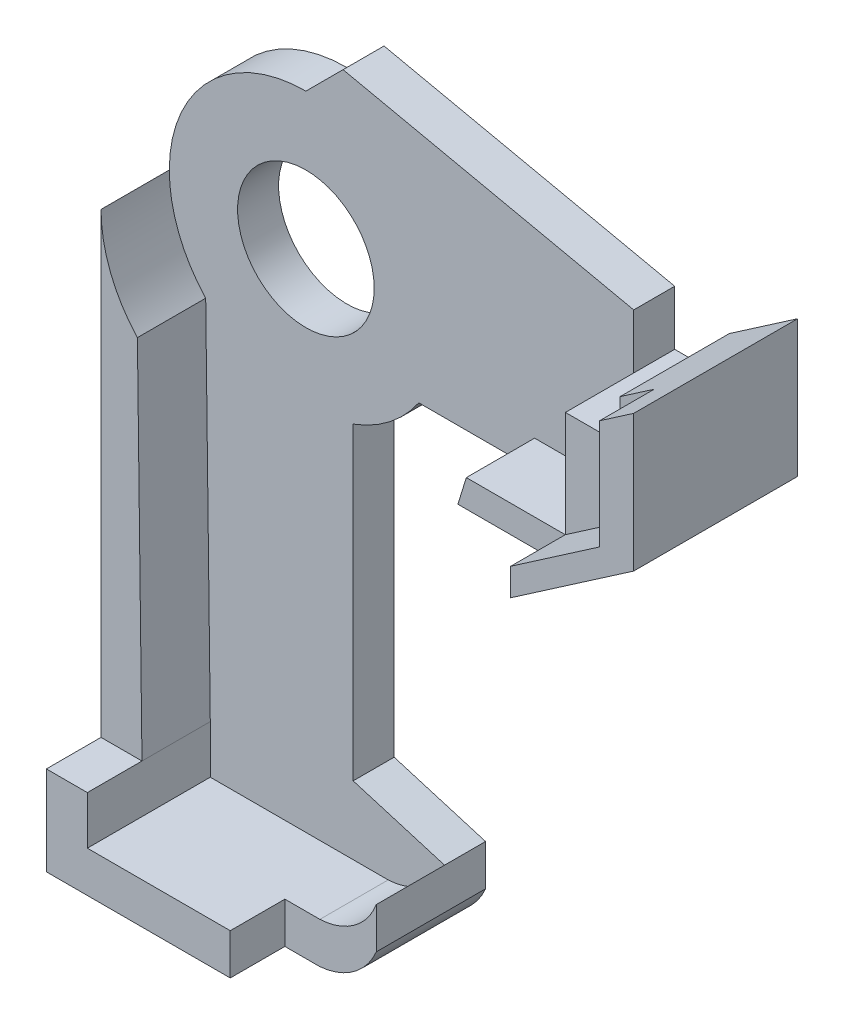
ISO-10303-21;
HEADER;
FILE_DESCRIPTION(('STEP AP214'),'2;1');
FILE_NAME('part.step','',(''),(''),'','','');
FILE_SCHEMA(('AUTOMOTIVE_DESIGN { 1 0 10303 214 1 1 1 1 }'));
ENDSEC;
DATA;
#1=APPLICATION_CONTEXT('core data for automotive mechanical design processes');
#2=APPLICATION_PROTOCOL_DEFINITION('international standard','automotive_design',2000,#1);
#3=PRODUCT_CONTEXT('',#1,'mechanical');
#4=PRODUCT('Part','Part','',(#3));
#5=PRODUCT_RELATED_PRODUCT_CATEGORY('part','',(#4));
#6=PRODUCT_DEFINITION_FORMATION('','',#4);
#7=PRODUCT_DEFINITION_CONTEXT('part definition',#1,'design');
#8=PRODUCT_DEFINITION('design','',#6,#7);
#9=PRODUCT_DEFINITION_SHAPE('','',#8);
#10=(LENGTH_UNIT() NAMED_UNIT(*) SI_UNIT(.MILLI.,.METRE.));
#11=(NAMED_UNIT(*) PLANE_ANGLE_UNIT() SI_UNIT($,.RADIAN.));
#12=(NAMED_UNIT(*) SI_UNIT($,.STERADIAN.) SOLID_ANGLE_UNIT());
#13=UNCERTAINTY_MEASURE_WITH_UNIT(LENGTH_MEASURE(1.E-05),#10,'distance_accuracy_value','');
#14=(GEOMETRIC_REPRESENTATION_CONTEXT(3) GLOBAL_UNCERTAINTY_ASSIGNED_CONTEXT((#13)) GLOBAL_UNIT_ASSIGNED_CONTEXT((#10,
#11,#12)) REPRESENTATION_CONTEXT('',''));
#15=CARTESIAN_POINT('',(0.,0.,0.));
#16=DIRECTION('',(0.,0.,1.));
#17=DIRECTION('',(1.,0.,0.));
#18=AXIS2_PLACEMENT_3D('',#15,#16,#17);
#19=CARTESIAN_POINT('',(0.,0.,1.5));
#20=DIRECTION('',(0.,0.,-1.));
#21=DIRECTION('',(-1.,0.,0.));
#22=AXIS2_PLACEMENT_3D('',#19,#20,#21);
#23=CYLINDRICAL_SURFACE('',#22,5.);
#24=DIRECTION('',(0.,0.,-1.));
#25=VECTOR('',#24,1.);
#26=CARTESIAN_POINT('',(-5.,0.,4.));
#27=LINE('',#26,#25);
#28=CARTESIAN_POINT('',(-5.,0.,1.5));
#29=VERTEX_POINT('',#28);
#30=CARTESIAN_POINT('',(-5.,0.,0.));
#31=VERTEX_POINT('',#30);
#32=EDGE_CURVE('E56',#29,#31,#27,.T.);
#33=ORIENTED_EDGE('',*,*,#32,.F.);
#34=CARTESIAN_POINT('',(0.,0.,1.5));
#35=DIRECTION('',(0.,0.,1.));
#36=DIRECTION('',(1.,0.,0.));
#37=AXIS2_PLACEMENT_3D('',#34,#35,#36);
#38=CIRCLE('',#37,5.);
#39=CARTESIAN_POINT('',(0.,5.,1.5));
#40=VERTEX_POINT('',#39);
#41=EDGE_CURVE('E301',#40,#29,#38,.T.);
#42=ORIENTED_EDGE('',*,*,#41,.F.);
#43=DIRECTION('',(0.,0.,-1.));
#44=VECTOR('',#43,1.);
#45=CARTESIAN_POINT('',(0.,5.,1.5));
#46=LINE('',#45,#44);
#47=CARTESIAN_POINT('',(0.,5.,0.));
#48=VERTEX_POINT('',#47);
#49=EDGE_CURVE('E376',#40,#48,#46,.T.);
#50=ORIENTED_EDGE('',*,*,#49,.T.);
#51=CARTESIAN_POINT('',(0.,0.,0.));
#52=DIRECTION('',(0.,0.,1.));
#53=DIRECTION('',(1.,0.,0.));
#54=AXIS2_PLACEMENT_3D('',#51,#52,#53);
#55=CIRCLE('',#54,5.);
#56=EDGE_CURVE('E52',#48,#31,#55,.T.);
#57=ORIENTED_EDGE('',*,*,#56,.T.);
#58=EDGE_LOOP('',(#33,#42,#50,#57));
#59=FACE_BOUND('',#58,.T.);
#60=ADVANCED_FACE('F35',(#59),#23,.T.);
#61=CARTESIAN_POINT('',(4.70245599561732,-6.8335047062513,6.));
#62=DIRECTION('',(0.566890714284149,-0.823793006803534,0.));
#63=DIRECTION('',(0.823793006803534,0.566890714284149,0.));
#64=AXIS2_PLACEMENT_3D('',#61,#62,#63);
#65=PLANE('',#64);
#66=DIRECTION('',(0.,0.,-1.));
#67=VECTOR('',#66,1.);
#68=CARTESIAN_POINT('',(15.25,0.424756416635361,6.));
#69=LINE('',#68,#67);
#70=CARTESIAN_POINT('',(15.25,0.424756416635361,6.));
#71=VERTEX_POINT('',#70);
#72=CARTESIAN_POINT('',(15.25,0.424756416635361,4.));
#73=VERTEX_POINT('',#72);
#74=EDGE_CURVE('E464',#71,#73,#69,.T.);
#75=ORIENTED_EDGE('',*,*,#74,.T.);
#76=DIRECTION('',(-0.823793006803534,-0.566890714284149,0.));
#77=VECTOR('',#76,1.);
#78=CARTESIAN_POINT('',(4.70245599561732,-6.8335047062513,4.));
#79=LINE('',#78,#77);
#80=CARTESIAN_POINT('',(11.9951705439841,-1.81504481978615,4.));
#81=VERTEX_POINT('',#80);
#82=EDGE_CURVE('E420',#73,#81,#79,.T.);
#83=ORIENTED_EDGE('',*,*,#82,.T.);
#84=DIRECTION('',(0.,0.,-1.));
#85=VECTOR('',#84,1.);
#86=CARTESIAN_POINT('',(11.9951705439841,-1.81504481978615,6.));
#87=LINE('',#86,#85);
#88=CARTESIAN_POINT('',(11.9951705439841,-1.81504481978615,6.));
#89=VERTEX_POINT('',#88);
#90=EDGE_CURVE('E11',#89,#81,#87,.T.);
#91=ORIENTED_EDGE('',*,*,#90,.F.);
#92=DIRECTION('',(-0.823793006803534,-0.566890714284149,0.));
#93=VECTOR('',#92,1.);
#94=CARTESIAN_POINT('',(4.70245599561732,-6.8335047062513,6.));
#95=LINE('',#94,#93);
#96=EDGE_CURVE('E447',#71,#89,#95,.T.);
#97=ORIENTED_EDGE('',*,*,#96,.F.);
#98=EDGE_LOOP('',(#75,#83,#91,#97));
#99=FACE_BOUND('',#98,.T.);
#100=ADVANCED_FACE('F37',(#99),#65,.F.);
#101=CARTESIAN_POINT('',(11.9951705439841,0.,6.));
#102=DIRECTION('',(1.,0.,0.));
#103=DIRECTION('',(0.,0.,-1.));
#104=AXIS2_PLACEMENT_3D('',#101,#102,#103);
#105=PLANE('',#104);
#106=ORIENTED_EDGE('',*,*,#90,.T.);
#107=DIRECTION('',(0.,-1.,0.));
#108=VECTOR('',#107,1.);
#109=CARTESIAN_POINT('',(11.9951705439841,0.,4.));
#110=LINE('',#109,#108);
#111=CARTESIAN_POINT('',(11.9951705439841,-2.81504481978616,4.));
#112=VERTEX_POINT('',#111);
#113=EDGE_CURVE('E389',#81,#112,#110,.T.);
#114=ORIENTED_EDGE('',*,*,#113,.T.);
#115=DIRECTION('',(0.,0.,-1.));
#116=VECTOR('',#115,1.);
#117=CARTESIAN_POINT('',(11.9951705439841,-2.81504481978616,6.));
#118=LINE('',#117,#116);
#119=CARTESIAN_POINT('',(11.9951705439841,-2.81504481978616,6.));
#120=VERTEX_POINT('',#119);
#121=EDGE_CURVE('E44',#120,#112,#118,.T.);
#122=ORIENTED_EDGE('',*,*,#121,.F.);
#123=DIRECTION('',(0.,-1.,0.));
#124=VECTOR('',#123,1.);
#125=CARTESIAN_POINT('',(11.9951705439841,0.,6.));
#126=LINE('',#125,#124);
#127=EDGE_CURVE('E450',#89,#120,#126,.T.);
#128=ORIENTED_EDGE('',*,*,#127,.F.);
#129=EDGE_LOOP('',(#106,#114,#122,#128));
#130=FACE_BOUND('',#129,.T.);
#131=ADVANCED_FACE('F485',(#130),#105,.F.);
#132=CARTESIAN_POINT('',(5.16945660166646,-7.51213962430971,6.));
#133=DIRECTION('',(0.566890714284149,-0.823793006803534,0.));
#134=DIRECTION('',(0.823793006803534,0.566890714284149,0.));
#135=AXIS2_PLACEMENT_3D('',#132,#133,#134);
#136=PLANE('',#135);
#137=DIRECTION('',(-0.823793006803534,-0.566890714284149,0.));
#138=VECTOR('',#137,1.);
#139=CARTESIAN_POINT('',(5.16945660166646,-7.51213962430971,0.));
#140=LINE('',#139,#138);
#141=CARTESIAN_POINT('',(16.5,0.284940209169283,0.));
#142=VERTEX_POINT('',#141);
#143=CARTESIAN_POINT('',(11.9951705439841,-2.81504481978616,0.));
#144=VERTEX_POINT('',#143);
#145=EDGE_CURVE('E446',#142,#144,#140,.T.);
#146=ORIENTED_EDGE('',*,*,#145,.F.);
#147=DIRECTION('',(0.,0.,-1.));
#148=VECTOR('',#147,1.);
#149=CARTESIAN_POINT('',(16.5,0.284940209169283,6.));
#150=LINE('',#149,#148);
#151=CARTESIAN_POINT('',(16.5,0.284940209169283,6.));
#152=VERTEX_POINT('',#151);
#153=EDGE_CURVE('E477',#152,#142,#150,.T.);
#154=ORIENTED_EDGE('',*,*,#153,.F.);
#155=DIRECTION('',(-0.823793006803534,-0.566890714284149,0.));
#156=VECTOR('',#155,1.);
#157=CARTESIAN_POINT('',(5.16945660166646,-7.51213962430971,6.));
#158=LINE('',#157,#156);
#159=EDGE_CURVE('E453',#152,#120,#158,.T.);
#160=ORIENTED_EDGE('',*,*,#159,.T.);
#161=ORIENTED_EDGE('',*,*,#121,.T.);
#162=DIRECTION('',(0.,0.,-1.));
#163=VECTOR('',#162,1.);
#164=CARTESIAN_POINT('',(11.9951705439841,-2.81504481978616,4.));
#165=LINE('',#164,#163);
#166=EDGE_CURVE('E393',#112,#144,#165,.T.);
#167=ORIENTED_EDGE('',*,*,#166,.T.);
#168=EDGE_LOOP('',(#146,#154,#160,#161,#167));
#169=FACE_BOUND('',#168,.T.);
#170=ADVANCED_FACE('F482',(#169),#136,.T.);
#171=CARTESIAN_POINT('',(16.5,0.,6.));
#172=DIRECTION('',(1.,0.,0.));
#173=DIRECTION('',(0.,0.,-1.));
#174=AXIS2_PLACEMENT_3D('',#171,#172,#173);
#175=PLANE('',#174);
#176=DIRECTION('',(0.,-1.,0.));
#177=VECTOR('',#176,1.);
#178=CARTESIAN_POINT('',(16.5,0.,0.));
#179=LINE('',#178,#177);
#180=CARTESIAN_POINT('',(16.5,5.28494020916929,0.));
#181=VERTEX_POINT('',#180);
#182=EDGE_CURVE('E466',#181,#142,#179,.T.);
#183=ORIENTED_EDGE('',*,*,#182,.F.);
#184=DIRECTION('',(0.,0.,-1.));
#185=VECTOR('',#184,1.);
#186=CARTESIAN_POINT('',(16.5,5.28494020916929,6.));
#187=LINE('',#186,#185);
#188=CARTESIAN_POINT('',(16.5,5.28494020916929,6.));
#189=VERTEX_POINT('',#188);
#190=EDGE_CURVE('E475',#189,#181,#187,.T.);
#191=ORIENTED_EDGE('',*,*,#190,.F.);
#192=DIRECTION('',(0.,-1.,0.));
#193=VECTOR('',#192,1.);
#194=CARTESIAN_POINT('',(16.5,0.,6.));
#195=LINE('',#194,#193);
#196=EDGE_CURVE('E456',#189,#152,#195,.T.);
#197=ORIENTED_EDGE('',*,*,#196,.T.);
#198=ORIENTED_EDGE('',*,*,#153,.T.);
#199=EDGE_LOOP('',(#183,#191,#197,#198));
#200=FACE_BOUND('',#199,.T.);
#201=ADVANCED_FACE('F522',(#200),#175,.T.);
#202=CARTESIAN_POINT('',(2.83445357142075,-4.11896503401767,6.));
#203=DIRECTION('',(-0.566890714284149,0.823793006803534,0.));
#204=DIRECTION('',(-0.823793006803534,-0.566890714284149,0.));
#205=AXIS2_PLACEMENT_3D('',#202,#203,#204);
#206=PLANE('',#205);
#207=DIRECTION('',(0.823793006803534,0.566890714284149,0.));
#208=VECTOR('',#207,1.);
#209=CARTESIAN_POINT('',(2.83445357142075,-4.11896503401767,0.));
#210=LINE('',#209,#208);
#211=CARTESIAN_POINT('',(14.,3.56457262410144,0.));
#212=VERTEX_POINT('',#211);
#213=EDGE_CURVE('E451',#212,#181,#210,.T.);
#214=ORIENTED_EDGE('',*,*,#213,.F.);
#215=DIRECTION('',(0.,0.,-1.));
#216=VECTOR('',#215,1.);
#217=CARTESIAN_POINT('',(14.,3.56457262410144,4.));
#218=LINE('',#217,#216);
#219=CARTESIAN_POINT('',(14.,3.56457262410144,4.));
#220=VERTEX_POINT('',#219);
#221=EDGE_CURVE('E437',#220,#212,#218,.T.);
#222=ORIENTED_EDGE('',*,*,#221,.F.);
#223=DIRECTION('',(0.823793006803534,0.566890714284149,0.));
#224=VECTOR('',#223,1.);
#225=CARTESIAN_POINT('',(2.83445357142075,-4.11896503401767,4.));
#226=LINE('',#225,#224);
#227=CARTESIAN_POINT('',(15.25,4.42475641663536,4.));
#228=VERTEX_POINT('',#227);
#229=EDGE_CURVE('E425',#220,#228,#226,.T.);
#230=ORIENTED_EDGE('',*,*,#229,.T.);
#231=DIRECTION('',(0.,0.,-1.));
#232=VECTOR('',#231,1.);
#233=CARTESIAN_POINT('',(15.25,4.42475641663536,6.));
#234=LINE('',#233,#232);
#235=CARTESIAN_POINT('',(15.25,4.42475641663536,6.));
#236=VERTEX_POINT('',#235);
#237=EDGE_CURVE('E473',#236,#228,#234,.T.);
#238=ORIENTED_EDGE('',*,*,#237,.F.);
#239=DIRECTION('',(0.823793006803534,0.566890714284149,0.));
#240=VECTOR('',#239,1.);
#241=CARTESIAN_POINT('',(2.83445357142075,-4.11896503401767,6.));
#242=LINE('',#241,#240);
#243=EDGE_CURVE('E459',#236,#189,#242,.T.);
#244=ORIENTED_EDGE('',*,*,#243,.T.);
#245=ORIENTED_EDGE('',*,*,#190,.T.);
#246=EDGE_LOOP('',(#214,#222,#230,#238,#244,#245));
#247=FACE_BOUND('',#246,.T.);
#248=ADVANCED_FACE('F524',(#247),#206,.T.);
#249=CARTESIAN_POINT('',(15.25,0.,6.));
#250=DIRECTION('',(1.,0.,0.));
#251=DIRECTION('',(0.,0.,-1.));
#252=AXIS2_PLACEMENT_3D('',#249,#250,#251);
#253=PLANE('',#252);
#254=ORIENTED_EDGE('',*,*,#237,.T.);
#255=DIRECTION('',(0.,-1.,0.));
#256=VECTOR('',#255,1.);
#257=CARTESIAN_POINT('',(15.25,0.,4.));
#258=LINE('',#257,#256);
#259=EDGE_CURVE('E423',#228,#73,#258,.T.);
#260=ORIENTED_EDGE('',*,*,#259,.T.);
#261=ORIENTED_EDGE('',*,*,#74,.F.);
#262=DIRECTION('',(0.,-1.,0.));
#263=VECTOR('',#262,1.);
#264=CARTESIAN_POINT('',(15.25,0.,6.));
#265=LINE('',#264,#263);
#266=EDGE_CURVE('E462',#236,#71,#265,.T.);
#267=ORIENTED_EDGE('',*,*,#266,.F.);
#268=EDGE_LOOP('',(#254,#260,#261,#267));
#269=FACE_BOUND('',#268,.T.);
#270=ADVANCED_FACE('F527',(#269),#253,.F.);
#271=CARTESIAN_POINT('',(0.,0.,6.));
#272=DIRECTION('',(0.,0.,1.));
#273=DIRECTION('',(1.,0.,0.));
#274=AXIS2_PLACEMENT_3D('',#271,#272,#273);
#275=PLANE('',#274);
#276=ORIENTED_EDGE('',*,*,#96,.T.);
#277=ORIENTED_EDGE('',*,*,#127,.T.);
#278=ORIENTED_EDGE('',*,*,#159,.F.);
#279=ORIENTED_EDGE('',*,*,#196,.F.);
#280=ORIENTED_EDGE('',*,*,#243,.F.);
#281=ORIENTED_EDGE('',*,*,#266,.T.);
#282=EDGE_LOOP('',(#276,#277,#278,#279,#280,#281));
#283=FACE_BOUND('',#282,.T.);
#284=ADVANCED_FACE('F520',(#283),#275,.T.);
#285=CARTESIAN_POINT('',(0.,0.,0.));
#286=DIRECTION('',(0.,0.,1.));
#287=DIRECTION('',(1.,0.,0.));
#288=AXIS2_PLACEMENT_3D('',#285,#286,#287);
#289=PLANE('',#288);
#290=DIRECTION('',(0.,-1.,0.));
#291=VECTOR('',#290,1.);
#292=CARTESIAN_POINT('',(-5.,0.,0.));
#293=LINE('',#292,#291);
#294=CARTESIAN_POINT('',(-5.,-20.,0.));
#295=VERTEX_POINT('',#294);
#296=EDGE_CURVE('E643',#31,#295,#293,.T.);
#297=ORIENTED_EDGE('',*,*,#296,.F.);
#298=ORIENTED_EDGE('',*,*,#56,.F.);
#299=DIRECTION('',(0.707106781186548,0.707106781186548,0.));
#300=VECTOR('',#299,1.);
#301=CARTESIAN_POINT('',(-2.5,2.5,0.));
#302=LINE('',#301,#300);
#303=CARTESIAN_POINT('',(1.36032487936079,6.36032487936079,0.));
#304=VERTEX_POINT('',#303);
#305=EDGE_CURVE('E342',#48,#304,#302,.T.);
#306=ORIENTED_EDGE('',*,*,#305,.T.);
#307=DIRECTION('',(0.977503613626163,-0.210918669983939,0.));
#308=VECTOR('',#307,1.);
#309=CARTESIAN_POINT('',(1.37184845337468,6.35783840578608,0.));
#310=LINE('',#309,#308);
#311=CARTESIAN_POINT('',(12.,4.06457262410144,0.));
#312=VERTEX_POINT('',#311);
#313=EDGE_CURVE('E355',#304,#312,#310,.T.);
#314=ORIENTED_EDGE('',*,*,#313,.T.);
#315=DIRECTION('',(0.,-1.,0.));
#316=VECTOR('',#315,1.);
#317=CARTESIAN_POINT('',(12.,0.,0.));
#318=LINE('',#317,#316);
#319=CARTESIAN_POINT('',(12.,2.06457262410144,0.));
#320=VERTEX_POINT('',#319);
#321=EDGE_CURVE('E352',#312,#320,#318,.T.);
#322=ORIENTED_EDGE('',*,*,#321,.T.);
#323=DIRECTION('',(1.,0.,0.));
#324=VECTOR('',#323,1.);
#325=CARTESIAN_POINT('',(0.,2.06457262410144,0.));
#326=LINE('',#325,#324);
#327=CARTESIAN_POINT('',(14.,2.06457262410144,0.));
#328=VERTEX_POINT('',#327);
#329=EDGE_CURVE('E410',#320,#328,#326,.T.);
#330=ORIENTED_EDGE('',*,*,#329,.T.);
#331=DIRECTION('',(0.,1.,0.));
#332=VECTOR('',#331,1.);
#333=CARTESIAN_POINT('',(14.,0.,0.));
#334=LINE('',#333,#332);
#335=EDGE_CURVE('E417',#328,#212,#334,.T.);
#336=ORIENTED_EDGE('',*,*,#335,.T.);
#337=ORIENTED_EDGE('',*,*,#213,.T.);
#338=ORIENTED_EDGE('',*,*,#182,.T.);
#339=ORIENTED_EDGE('',*,*,#145,.T.);
#340=DIRECTION('',(-1.,0.,0.));
#341=VECTOR('',#340,1.);
#342=CARTESIAN_POINT('',(0.,-2.81504481978616,0.));
#343=LINE('',#342,#341);
#344=CARTESIAN_POINT('',(4.13225394459188,-2.81504481978616,0.));
#345=VERTEX_POINT('',#344);
#346=EDGE_CURVE('E378',#144,#345,#343,.T.);
#347=ORIENTED_EDGE('',*,*,#346,.T.);
#348=CARTESIAN_POINT('',(1.73077211965571,-4.69088774858475,0.));
#349=VERTEX_POINT('',#348);
#350=EDGE_CURVE('E348',#349,#345,#55,.T.);
#351=ORIENTED_EDGE('',*,*,#350,.F.);
#352=DIRECTION('',(0.,1.,0.));
#353=VECTOR('',#352,1.);
#354=CARTESIAN_POINT('',(1.73077211965571,0.,0.));
#355=LINE('',#354,#353);
#356=CARTESIAN_POINT('',(1.73077211965571,-16.,0.));
#357=VERTEX_POINT('',#356);
#358=EDGE_CURVE('E350',#357,#349,#355,.T.);
#359=ORIENTED_EDGE('',*,*,#358,.F.);
#360=DIRECTION('',(-0.958101396175861,0.286429248935696,0.));
#361=VECTOR('',#360,1.);
#362=CARTESIAN_POINT('',(-4.24885670061648,-14.2123597786821,0.));
#363=LINE('',#362,#361);
#364=CARTESIAN_POINT('',(5.07575661315957,-17.,0.));
#365=VERTEX_POINT('',#364);
#366=EDGE_CURVE('E347',#365,#357,#363,.T.);
#367=ORIENTED_EDGE('',*,*,#366,.F.);
#368=DIRECTION('',(0.,1.,0.));
#369=VECTOR('',#368,1.);
#370=CARTESIAN_POINT('',(5.07575661315957,0.,0.));
#371=LINE('',#370,#369);
#372=CARTESIAN_POINT('',(5.07575661315957,-18.5,0.));
#373=VERTEX_POINT('',#372);
#374=EDGE_CURVE('E272',#373,#365,#371,.T.);
#375=ORIENTED_EDGE('',*,*,#374,.F.);
#376=CARTESIAN_POINT('',(2.79978677677735,-17.5384030109005,0.));
#377=DIRECTION('',(0.,0.,1.));
#378=DIRECTION('',(1.,0.,0.));
#379=AXIS2_PLACEMENT_3D('',#376,#377,#378);
#380=CIRCLE('',#379,2.47077062180344);
#381=CARTESIAN_POINT('',(3.01250191216558,-20.,0.));
#382=VERTEX_POINT('',#381);
#383=EDGE_CURVE('E252',#373,#382,#380,.F.);
#384=ORIENTED_EDGE('',*,*,#383,.T.);
#385=DIRECTION('',(1.,0.,0.));
#386=VECTOR('',#385,1.);
#387=CARTESIAN_POINT('',(0.,-20.,0.));
#388=LINE('',#387,#386);
#389=EDGE_CURVE('E644',#295,#382,#388,.T.);
#390=ORIENTED_EDGE('',*,*,#389,.F.);
#391=EDGE_LOOP('',(#297,#298,#306,#314,#322,#330,#336,#337,#338,#339,#347,#351,#359,#367,#375,
#384,#390));
#392=FACE_BOUND('',#391,.T.);
#393=CARTESIAN_POINT('',(0.,0.,0.));
#394=DIRECTION('',(0.,0.,1.));
#395=DIRECTION('',(1.,0.,0.));
#396=AXIS2_PLACEMENT_3D('',#393,#394,#395);
#397=CIRCLE('',#396,2.5);
#398=CARTESIAN_POINT('',(2.5,0.,0.));
#399=VERTEX_POINT('',#398);
#400=EDGE_CURVE('E300',#399,#399,#397,.T.);
#401=ORIENTED_EDGE('',*,*,#400,.T.);
#402=EDGE_LOOP('',(#401));
#403=FACE_BOUND('',#402,.T.);
#404=ADVANCED_FACE('F515',(#392,#403),#289,.F.);
#405=CARTESIAN_POINT('',(0.,2.06457262410144,4.));
#406=DIRECTION('',(0.,1.,0.));
#407=DIRECTION('',(-1.,0.,0.));
#408=AXIS2_PLACEMENT_3D('',#405,#406,#407);
#409=PLANE('',#408);
#410=ORIENTED_EDGE('',*,*,#329,.F.);
#411=DIRECTION('',(0.,0.,-1.));
#412=VECTOR('',#411,1.);
#413=CARTESIAN_POINT('',(12.,2.06457262410144,1.5));
#414=LINE('',#413,#412);
#415=CARTESIAN_POINT('',(12.,2.06457262410144,1.5));
#416=VERTEX_POINT('',#415);
#417=EDGE_CURVE('E363',#416,#320,#414,.T.);
#418=ORIENTED_EDGE('',*,*,#417,.F.);
#419=DIRECTION('',(0.,0.,-1.));
#420=VECTOR('',#419,1.);
#421=CARTESIAN_POINT('',(12.,2.06457262410144,4.));
#422=LINE('',#421,#420);
#423=CARTESIAN_POINT('',(12.,2.06457262410144,4.));
#424=VERTEX_POINT('',#423);
#425=EDGE_CURVE('E443',#424,#416,#422,.T.);
#426=ORIENTED_EDGE('',*,*,#425,.F.);
#427=DIRECTION('',(1.,0.,0.));
#428=VECTOR('',#427,1.);
#429=CARTESIAN_POINT('',(0.,2.06457262410144,4.));
#430=LINE('',#429,#428);
#431=CARTESIAN_POINT('',(14.,2.06457262410144,4.));
#432=VERTEX_POINT('',#431);
#433=EDGE_CURVE('E413',#424,#432,#430,.T.);
#434=ORIENTED_EDGE('',*,*,#433,.T.);
#435=DIRECTION('',(0.,0.,-1.));
#436=VECTOR('',#435,1.);
#437=CARTESIAN_POINT('',(14.,2.06457262410144,4.));
#438=LINE('',#437,#436);
#439=EDGE_CURVE('E431',#432,#328,#438,.T.);
#440=ORIENTED_EDGE('',*,*,#439,.T.);
#441=EDGE_LOOP('',(#410,#418,#426,#434,#440));
#442=FACE_BOUND('',#441,.T.);
#443=ADVANCED_FACE('F701',(#442),#409,.T.);
#444=CARTESIAN_POINT('',(11.9974113712598,-0.0149347123422425,4.));
#445=DIRECTION('',(0.999999225202656,-0.00124482693046965,0.));
#446=DIRECTION('',(0.00124482693046965,0.999999225202656,0.));
#447=AXIS2_PLACEMENT_3D('',#444,#445,#446);
#448=PLANE('',#447);
#449=ORIENTED_EDGE('',*,*,#425,.T.);
#450=DIRECTION('',(-0.00124482693046965,-0.999999225202656,0.));
#451=VECTOR('',#450,1.);
#452=CARTESIAN_POINT('',(11.9974113712598,-0.0149347123422425,1.5));
#453=LINE('',#452,#451);
#454=CARTESIAN_POINT('',(11.9951705439841,-1.81504481978615,1.5));
#455=VERTEX_POINT('',#454);
#456=EDGE_CURVE('E329',#416,#455,#453,.T.);
#457=ORIENTED_EDGE('',*,*,#456,.T.);
#458=DIRECTION('',(0.,0.,-1.));
#459=VECTOR('',#458,1.);
#460=CARTESIAN_POINT('',(11.9951705439841,-1.81504481978615,4.));
#461=LINE('',#460,#459);
#462=EDGE_CURVE('E440',#81,#455,#461,.T.);
#463=ORIENTED_EDGE('',*,*,#462,.F.);
#464=DIRECTION('',(-0.00124482693046965,-0.999999225202656,0.));
#465=VECTOR('',#464,1.);
#466=CARTESIAN_POINT('',(11.9974113712598,-0.0149347123422425,4.));
#467=LINE('',#466,#465);
#468=EDGE_CURVE('E416',#424,#81,#467,.T.);
#469=ORIENTED_EDGE('',*,*,#468,.F.);
#470=EDGE_LOOP('',(#449,#457,#463,#469));
#471=FACE_BOUND('',#470,.T.);
#472=ADVANCED_FACE('F504',(#471),#448,.F.);
#473=CARTESIAN_POINT('',(14.,0.,4.));
#474=DIRECTION('',(-1.,0.,0.));
#475=DIRECTION('',(0.,0.,1.));
#476=AXIS2_PLACEMENT_3D('',#473,#474,#475);
#477=PLANE('',#476);
#478=ORIENTED_EDGE('',*,*,#335,.F.);
#479=ORIENTED_EDGE('',*,*,#439,.F.);
#480=DIRECTION('',(0.,1.,0.));
#481=VECTOR('',#480,1.);
#482=CARTESIAN_POINT('',(14.,0.,4.));
#483=LINE('',#482,#481);
#484=EDGE_CURVE('E428',#432,#220,#483,.T.);
#485=ORIENTED_EDGE('',*,*,#484,.T.);
#486=ORIENTED_EDGE('',*,*,#221,.T.);
#487=EDGE_LOOP('',(#478,#479,#485,#486));
#488=FACE_BOUND('',#487,.T.);
#489=ADVANCED_FACE('F695',(#488),#477,.T.);
#490=CARTESIAN_POINT('',(0.,0.,4.));
#491=DIRECTION('',(0.,0.,1.));
#492=DIRECTION('',(1.,0.,0.));
#493=AXIS2_PLACEMENT_3D('',#490,#491,#492);
#494=PLANE('',#493);
#495=ORIENTED_EDGE('',*,*,#433,.F.);
#496=ORIENTED_EDGE('',*,*,#468,.T.);
#497=ORIENTED_EDGE('',*,*,#82,.F.);
#498=ORIENTED_EDGE('',*,*,#259,.F.);
#499=ORIENTED_EDGE('',*,*,#229,.F.);
#500=ORIENTED_EDGE('',*,*,#484,.F.);
#501=EDGE_LOOP('',(#495,#496,#497,#498,#499,#500));
#502=FACE_BOUND('',#501,.T.);
#503=ADVANCED_FACE('F498',(#502),#494,.T.);
#504=CARTESIAN_POINT('',(0.,-1.81504481978616,4.));
#505=DIRECTION('',(0.,-1.,0.));
#506=DIRECTION('',(1.,0.,0.));
#507=AXIS2_PLACEMENT_3D('',#504,#505,#506);
#508=PLANE('',#507);
#509=ORIENTED_EDGE('',*,*,#462,.T.);
#510=DIRECTION('',(-1.,0.,0.));
#511=VECTOR('',#510,1.);
#512=CARTESIAN_POINT('',(0.,-1.81504481978616,1.5));
#513=LINE('',#512,#511);
#514=CARTESIAN_POINT('',(8.37259890466963,-1.81504481978616,1.5));
#515=VERTEX_POINT('',#514);
#516=EDGE_CURVE('E326',#455,#515,#513,.T.);
#517=ORIENTED_EDGE('',*,*,#516,.T.);
#518=DIRECTION('',(0.,0.,-1.));
#519=VECTOR('',#518,1.);
#520=CARTESIAN_POINT('',(8.37259890466963,-1.81504481978616,4.));
#521=LINE('',#520,#519);
#522=CARTESIAN_POINT('',(8.37259890466963,-1.81504481978616,4.));
#523=VERTEX_POINT('',#522);
#524=EDGE_CURVE('E406',#523,#515,#521,.T.);
#525=ORIENTED_EDGE('',*,*,#524,.F.);
#526=DIRECTION('',(-1.,0.,0.));
#527=VECTOR('',#526,1.);
#528=CARTESIAN_POINT('',(0.,-1.81504481978616,4.));
#529=LINE('',#528,#527);
#530=EDGE_CURVE('E379',#81,#523,#529,.T.);
#531=ORIENTED_EDGE('',*,*,#530,.F.);
#532=EDGE_LOOP('',(#509,#517,#525,#531));
#533=FACE_BOUND('',#532,.T.);
#534=ADVANCED_FACE('F506',(#533),#508,.F.);
#535=CARTESIAN_POINT('',(8.15515116300473,-2.51901740764807,4.));
#536=DIRECTION('',(0.955457683575142,-0.295128133015515,0.));
#537=DIRECTION('',(0.295128133015515,0.955457683575142,0.));
#538=AXIS2_PLACEMENT_3D('',#535,#536,#537);
#539=PLANE('',#538);
#540=ORIENTED_EDGE('',*,*,#524,.T.);
#541=DIRECTION('',(-0.295128133015515,-0.955457683575142,0.));
#542=VECTOR('',#541,1.);
#543=CARTESIAN_POINT('',(8.15515116300473,-2.51901740764807,1.5));
#544=LINE('',#543,#542);
#545=CARTESIAN_POINT('',(8.06371224428798,-2.81504481978616,1.5));
#546=VERTEX_POINT('',#545);
#547=EDGE_CURVE('E323',#515,#546,#544,.T.);
#548=ORIENTED_EDGE('',*,*,#547,.T.);
#549=DIRECTION('',(0.,0.,-1.));
#550=VECTOR('',#549,1.);
#551=CARTESIAN_POINT('',(8.06371224428798,-2.81504481978616,4.));
#552=LINE('',#551,#550);
#553=CARTESIAN_POINT('',(8.06371224428798,-2.81504481978616,4.));
#554=VERTEX_POINT('',#553);
#555=EDGE_CURVE('E399',#554,#546,#552,.T.);
#556=ORIENTED_EDGE('',*,*,#555,.F.);
#557=DIRECTION('',(-0.295128133015515,-0.955457683575142,0.));
#558=VECTOR('',#557,1.);
#559=CARTESIAN_POINT('',(8.15515116300473,-2.51901740764807,4.));
#560=LINE('',#559,#558);
#561=EDGE_CURVE('E382',#523,#554,#560,.T.);
#562=ORIENTED_EDGE('',*,*,#561,.F.);
#563=EDGE_LOOP('',(#540,#548,#556,#562));
#564=FACE_BOUND('',#563,.T.);
#565=ADVANCED_FACE('F508',(#564),#539,.F.);
#566=CARTESIAN_POINT('',(0.,-2.81504481978616,4.));
#567=DIRECTION('',(0.,-1.,0.));
#568=DIRECTION('',(1.,0.,0.));
#569=AXIS2_PLACEMENT_3D('',#566,#567,#568);
#570=PLANE('',#569);
#571=ORIENTED_EDGE('',*,*,#346,.F.);
#572=ORIENTED_EDGE('',*,*,#166,.F.);
#573=DIRECTION('',(-1.,0.,0.));
#574=VECTOR('',#573,1.);
#575=CARTESIAN_POINT('',(0.,-2.81504481978616,4.));
#576=LINE('',#575,#574);
#577=EDGE_CURVE('E384',#112,#554,#576,.T.);
#578=ORIENTED_EDGE('',*,*,#577,.T.);
#579=ORIENTED_EDGE('',*,*,#555,.T.);
#580=DIRECTION('',(-1.,0.,0.));
#581=VECTOR('',#580,1.);
#582=CARTESIAN_POINT('',(0.,-2.81504481978616,1.5));
#583=LINE('',#582,#581);
#584=CARTESIAN_POINT('',(4.13225394459188,-2.81504481978616,1.5));
#585=VERTEX_POINT('',#584);
#586=EDGE_CURVE('E320',#546,#585,#583,.T.);
#587=ORIENTED_EDGE('',*,*,#586,.T.);
#588=DIRECTION('',(0.,0.,-1.));
#589=VECTOR('',#588,1.);
#590=CARTESIAN_POINT('',(4.13225394459188,-2.81504481978616,1.5));
#591=LINE('',#590,#589);
#592=EDGE_CURVE('E365',#585,#345,#591,.T.);
#593=ORIENTED_EDGE('',*,*,#592,.T.);
#594=EDGE_LOOP('',(#571,#572,#578,#579,#587,#593));
#595=FACE_BOUND('',#594,.T.);
#596=ADVANCED_FACE('F509',(#595),#570,.T.);
#597=CARTESIAN_POINT('',(0.,0.,4.));
#598=DIRECTION('',(0.,0.,1.));
#599=DIRECTION('',(1.,0.,0.));
#600=AXIS2_PLACEMENT_3D('',#597,#598,#599);
#601=PLANE('',#600);
#602=ORIENTED_EDGE('',*,*,#530,.T.);
#603=ORIENTED_EDGE('',*,*,#561,.T.);
#604=ORIENTED_EDGE('',*,*,#577,.F.);
#605=ORIENTED_EDGE('',*,*,#113,.F.);
#606=EDGE_LOOP('',(#602,#603,#604,#605));
#607=FACE_BOUND('',#606,.T.);
#608=ADVANCED_FACE('F489',(#607),#601,.T.);
#609=CARTESIAN_POINT('',(-2.5,2.5,1.5));
#610=DIRECTION('',(-0.707106781186547,0.707106781186547,0.));
#611=DIRECTION('',(-0.707106781186548,-0.707106781186548,0.));
#612=AXIS2_PLACEMENT_3D('',#609,#610,#611);
#613=PLANE('',#612);
#614=ORIENTED_EDGE('',*,*,#305,.F.);
#615=ORIENTED_EDGE('',*,*,#49,.F.);
#616=DIRECTION('',(0.707106781186548,0.707106781186548,0.));
#617=VECTOR('',#616,1.);
#618=CARTESIAN_POINT('',(-2.5,2.5,1.5));
#619=LINE('',#618,#617);
#620=CARTESIAN_POINT('',(1.36032487936079,6.36032487936079,1.5));
#621=VERTEX_POINT('',#620);
#622=EDGE_CURVE('E296',#40,#621,#619,.T.);
#623=ORIENTED_EDGE('',*,*,#622,.T.);
#624=DIRECTION('',(0.,0.,-1.));
#625=VECTOR('',#624,1.);
#626=CARTESIAN_POINT('',(1.36032487936079,6.36032487936079,1.5));
#627=LINE('',#626,#625);
#628=EDGE_CURVE('E341',#621,#304,#627,.T.);
#629=ORIENTED_EDGE('',*,*,#628,.T.);
#630=EDGE_LOOP('',(#614,#615,#623,#629));
#631=FACE_BOUND('',#630,.T.);
#632=ADVANCED_FACE('F677',(#631),#613,.T.);
#633=CARTESIAN_POINT('',(-4.24885670061648,-14.2123597786821,1.5));
#634=DIRECTION('',(-0.286429248935696,-0.95810139617586,0.));
#635=DIRECTION('',(0.958101396175861,-0.286429248935696,0.));
#636=AXIS2_PLACEMENT_3D('',#633,#634,#635);
#637=PLANE('',#636);
#638=ORIENTED_EDGE('',*,*,#366,.T.);
#639=DIRECTION('',(0.,0.,-1.));
#640=VECTOR('',#639,1.);
#641=CARTESIAN_POINT('',(1.73077211965571,-16.,1.5));
#642=LINE('',#641,#640);
#643=CARTESIAN_POINT('',(1.73077211965571,-16.,1.5));
#644=VERTEX_POINT('',#643);
#645=EDGE_CURVE('E371',#644,#357,#642,.T.);
#646=ORIENTED_EDGE('',*,*,#645,.F.);
#647=DIRECTION('',(-0.958101396175861,0.286429248935696,0.));
#648=VECTOR('',#647,1.);
#649=CARTESIAN_POINT('',(-4.24885670061648,-14.2123597786821,1.5));
#650=LINE('',#649,#648);
#651=CARTESIAN_POINT('',(5.07575661315957,-17.,1.5));
#652=VERTEX_POINT('',#651);
#653=EDGE_CURVE('E316',#652,#644,#650,.T.);
#654=ORIENTED_EDGE('',*,*,#653,.F.);
#655=DIRECTION('',(0.,0.,-1.));
#656=VECTOR('',#655,1.);
#657=CARTESIAN_POINT('',(5.07575661315957,-17.,1.5));
#658=LINE('',#657,#656);
#659=EDGE_CURVE('E374',#652,#365,#658,.T.);
#660=ORIENTED_EDGE('',*,*,#659,.T.);
#661=EDGE_LOOP('',(#638,#646,#654,#660));
#662=FACE_BOUND('',#661,.T.);
#663=ADVANCED_FACE('F555',(#662),#637,.F.);
#664=CARTESIAN_POINT('',(1.73077211965571,0.,1.5));
#665=DIRECTION('',(-1.,0.,0.));
#666=DIRECTION('',(0.,0.,1.));
#667=AXIS2_PLACEMENT_3D('',#664,#665,#666);
#668=PLANE('',#667);
#669=ORIENTED_EDGE('',*,*,#358,.T.);
#670=DIRECTION('',(0.,0.,-1.));
#671=VECTOR('',#670,1.);
#672=CARTESIAN_POINT('',(1.73077211965571,-4.69088774858475,1.5));
#673=LINE('',#672,#671);
#674=CARTESIAN_POINT('',(1.73077211965571,-4.69088774858475,1.5));
#675=VERTEX_POINT('',#674);
#676=EDGE_CURVE('E368',#675,#349,#673,.T.);
#677=ORIENTED_EDGE('',*,*,#676,.F.);
#678=DIRECTION('',(0.,1.,0.));
#679=VECTOR('',#678,1.);
#680=CARTESIAN_POINT('',(1.73077211965571,0.,1.5));
#681=LINE('',#680,#679);
#682=EDGE_CURVE('E318',#644,#675,#681,.T.);
#683=ORIENTED_EDGE('',*,*,#682,.F.);
#684=ORIENTED_EDGE('',*,*,#645,.T.);
#685=EDGE_LOOP('',(#669,#677,#683,#684));
#686=FACE_BOUND('',#685,.T.);
#687=ADVANCED_FACE('F547',(#686),#668,.F.);
#688=ORIENTED_EDGE('',*,*,#350,.T.);
#689=ORIENTED_EDGE('',*,*,#592,.F.);
#690=EDGE_CURVE('E304',#675,#585,#38,.T.);
#691=ORIENTED_EDGE('',*,*,#690,.F.);
#692=ORIENTED_EDGE('',*,*,#676,.T.);
#693=EDGE_LOOP('',(#688,#689,#691,#692));
#694=FACE_BOUND('',#693,.T.);
#695=ADVANCED_FACE('F539',(#694),#23,.T.);
#696=CARTESIAN_POINT('',(12.,0.,1.5));
#697=DIRECTION('',(1.,0.,0.));
#698=DIRECTION('',(0.,1.,0.));
#699=AXIS2_PLACEMENT_3D('',#696,#697,#698);
#700=PLANE('',#699);
#701=ORIENTED_EDGE('',*,*,#321,.F.);
#702=DIRECTION('',(0.,0.,-1.));
#703=VECTOR('',#702,1.);
#704=CARTESIAN_POINT('',(12.,4.06457262410144,1.5));
#705=LINE('',#704,#703);
#706=CARTESIAN_POINT('',(12.,4.06457262410144,1.5));
#707=VERTEX_POINT('',#706);
#708=EDGE_CURVE('E361',#707,#312,#705,.T.);
#709=ORIENTED_EDGE('',*,*,#708,.F.);
#710=DIRECTION('',(0.,-1.,0.));
#711=VECTOR('',#710,1.);
#712=CARTESIAN_POINT('',(12.,0.,1.5));
#713=LINE('',#712,#711);
#714=EDGE_CURVE('E332',#707,#416,#713,.T.);
#715=ORIENTED_EDGE('',*,*,#714,.T.);
#716=ORIENTED_EDGE('',*,*,#417,.T.);
#717=EDGE_LOOP('',(#701,#709,#715,#716));
#718=FACE_BOUND('',#717,.T.);
#719=ADVANCED_FACE('F546',(#718),#700,.T.);
#720=CARTESIAN_POINT('',(1.37184845337468,6.35783840578608,1.5));
#721=DIRECTION('',(0.210918669983939,0.977503613626162,0.));
#722=DIRECTION('',(-0.977503613626163,0.210918669983939,0.));
#723=AXIS2_PLACEMENT_3D('',#720,#721,#722);
#724=PLANE('',#723);
#725=ORIENTED_EDGE('',*,*,#313,.F.);
#726=ORIENTED_EDGE('',*,*,#628,.F.);
#727=DIRECTION('',(0.977503613626163,-0.210918669983939,0.));
#728=VECTOR('',#727,1.);
#729=CARTESIAN_POINT('',(1.37184845337468,6.35783840578608,1.5));
#730=LINE('',#729,#728);
#731=EDGE_CURVE('E335',#621,#707,#730,.T.);
#732=ORIENTED_EDGE('',*,*,#731,.T.);
#733=ORIENTED_EDGE('',*,*,#708,.T.);
#734=EDGE_LOOP('',(#725,#726,#732,#733));
#735=FACE_BOUND('',#734,.T.);
#736=ADVANCED_FACE('F553',(#735),#724,.T.);
#737=CARTESIAN_POINT('',(0.,0.,1.5));
#738=DIRECTION('',(0.,0.,-1.));
#739=DIRECTION('',(-1.,0.,0.));
#740=AXIS2_PLACEMENT_3D('',#737,#738,#739);
#741=CYLINDRICAL_SURFACE('',#740,2.5);
#742=CARTESIAN_POINT('',(0.,0.,1.5));
#743=DIRECTION('',(0.,0.,1.));
#744=DIRECTION('',(1.,0.,0.));
#745=AXIS2_PLACEMENT_3D('',#742,#743,#744);
#746=CIRCLE('',#745,2.5);
#747=CARTESIAN_POINT('',(2.5,0.,1.5));
#748=VERTEX_POINT('',#747);
#749=EDGE_CURVE('E338',#748,#748,#746,.T.);
#750=ORIENTED_EDGE('',*,*,#749,.T.);
#751=EDGE_LOOP('',(#750));
#752=FACE_BOUND('',#751,.T.);
#753=ORIENTED_EDGE('',*,*,#400,.F.);
#754=EDGE_LOOP('',(#753));
#755=FACE_BOUND('',#754,.T.);
#756=ADVANCED_FACE('F774',(#752,#755),#741,.F.);
#757=CARTESIAN_POINT('',(0.,0.,1.5));
#758=DIRECTION('',(0.,0.,1.));
#759=DIRECTION('',(1.,0.,0.));
#760=AXIS2_PLACEMENT_3D('',#757,#758,#759);
#761=PLANE('',#760);
#762=ORIENTED_EDGE('',*,*,#622,.F.);
#763=ORIENTED_EDGE('',*,*,#41,.T.);
#764=CARTESIAN_POINT('',(-3.66772097123025,-3.39820877481031,1.5));
#765=VERTEX_POINT('',#764);
#766=EDGE_CURVE('E299',#29,#765,#38,.T.);
#767=ORIENTED_EDGE('',*,*,#766,.T.);
#768=DIRECTION('',(-0.0125729103069972,0.999920957839375,0.));
#769=VECTOR('',#768,1.);
#770=CARTESIAN_POINT('',(-3.70986318198892,-0.0466474641547325,1.5));
#771=LINE('',#770,#769);
#772=CARTESIAN_POINT('',(-3.5,-16.7370229480866,1.5));
#773=VERTEX_POINT('',#772);
#774=EDGE_CURVE('E303',#773,#765,#771,.T.);
#775=ORIENTED_EDGE('',*,*,#774,.F.);
#776=DIRECTION('',(0.,1.,0.));
#777=VECTOR('',#776,1.);
#778=CARTESIAN_POINT('',(-3.5,0.,1.5));
#779=LINE('',#778,#777);
#780=CARTESIAN_POINT('',(-3.5,-18.5,1.5));
#781=VERTEX_POINT('',#780);
#782=EDGE_CURVE('E307',#781,#773,#779,.T.);
#783=ORIENTED_EDGE('',*,*,#782,.F.);
#784=DIRECTION('',(-1.,0.,0.));
#785=VECTOR('',#784,1.);
#786=CARTESIAN_POINT('',(0.,-18.5,1.5));
#787=LINE('',#786,#785);
#788=CARTESIAN_POINT('',(3.01250191216558,-18.5,1.5));
#789=VERTEX_POINT('',#788);
#790=EDGE_CURVE('E310',#789,#781,#787,.T.);
#791=ORIENTED_EDGE('',*,*,#790,.F.);
#792=CARTESIAN_POINT('',(2.90371065957764,-16.1813506373893,1.5));
#793=DIRECTION('',(0.,0.,1.));
#794=DIRECTION('',(1.,0.,0.));
#795=AXIS2_PLACEMENT_3D('',#792,#793,#794);
#796=CIRCLE('',#795,2.32120020751647);
#797=EDGE_CURVE('E313',#652,#789,#796,.F.);
#798=ORIENTED_EDGE('',*,*,#797,.F.);
#799=ORIENTED_EDGE('',*,*,#653,.T.);
#800=ORIENTED_EDGE('',*,*,#682,.T.);
#801=ORIENTED_EDGE('',*,*,#690,.T.);
#802=ORIENTED_EDGE('',*,*,#586,.F.);
#803=ORIENTED_EDGE('',*,*,#547,.F.);
#804=ORIENTED_EDGE('',*,*,#516,.F.);
#805=ORIENTED_EDGE('',*,*,#456,.F.);
#806=ORIENTED_EDGE('',*,*,#714,.F.);
#807=ORIENTED_EDGE('',*,*,#731,.F.);
#808=EDGE_LOOP('',(#762,#763,#767,#775,#783,#791,#798,#799,#800,#801,#802,#803,#804,#805,#806,#807));
#809=FACE_BOUND('',#808,.T.);
#810=ORIENTED_EDGE('',*,*,#749,.F.);
#811=EDGE_LOOP('',(#810));
#812=FACE_BOUND('',#811,.T.);
#813=ADVANCED_FACE('F674',(#809,#812),#761,.T.);
#814=CARTESIAN_POINT('',(-3.5,0.,6.));
#815=DIRECTION('',(-1.,0.,0.));
#816=DIRECTION('',(0.,-1.,0.));
#817=AXIS2_PLACEMENT_3D('',#814,#815,#816);
#818=PLANE('',#817);
#819=ORIENTED_EDGE('',*,*,#782,.T.);
#820=DIRECTION('',(0.,0.,-1.));
#821=VECTOR('',#820,1.);
#822=CARTESIAN_POINT('',(-3.5,-16.7370229480866,4.));
#823=LINE('',#822,#821);
#824=CARTESIAN_POINT('',(-3.5,-16.7370229480866,4.));
#825=VERTEX_POINT('',#824);
#826=EDGE_CURVE('E591',#825,#773,#823,.T.);
#827=ORIENTED_EDGE('',*,*,#826,.F.);
#828=DIRECTION('',(0.,0.,-1.));
#829=VECTOR('',#828,1.);
#830=CARTESIAN_POINT('',(-3.5,-16.7370229480866,6.));
#831=LINE('',#830,#829);
#832=CARTESIAN_POINT('',(-3.5,-16.7370229480866,6.));
#833=VERTEX_POINT('',#832);
#834=EDGE_CURVE('E345',#833,#825,#831,.T.);
#835=ORIENTED_EDGE('',*,*,#834,.F.);
#836=DIRECTION('',(0.,1.,0.));
#837=VECTOR('',#836,1.);
#838=CARTESIAN_POINT('',(-3.5,0.,6.));
#839=LINE('',#838,#837);
#840=CARTESIAN_POINT('',(-3.5,-18.5,6.));
#841=VERTEX_POINT('',#840);
#842=EDGE_CURVE('E630',#841,#833,#839,.T.);
#843=ORIENTED_EDGE('',*,*,#842,.F.);
#844=DIRECTION('',(0.,0.,-1.));
#845=VECTOR('',#844,1.);
#846=CARTESIAN_POINT('',(-3.5,-18.5,6.));
#847=LINE('',#846,#845);
#848=EDGE_CURVE('E601',#841,#781,#847,.T.);
#849=ORIENTED_EDGE('',*,*,#848,.T.);
#850=EDGE_LOOP('',(#819,#827,#835,#843,#849));
#851=FACE_BOUND('',#850,.T.);
#852=ADVANCED_FACE('F628',(#851),#818,.F.);
#853=CARTESIAN_POINT('',(0.,-16.7370229480866,6.));
#854=DIRECTION('',(0.,-1.,0.));
#855=DIRECTION('',(0.,0.,-1.));
#856=AXIS2_PLACEMENT_3D('',#853,#854,#855);
#857=PLANE('',#856);
#858=ORIENTED_EDGE('',*,*,#834,.T.);
#859=DIRECTION('',(-1.,0.,0.));
#860=VECTOR('',#859,1.);
#861=CARTESIAN_POINT('',(0.,-16.7370229480866,4.));
#862=LINE('',#861,#860);
#863=CARTESIAN_POINT('',(-5.,-16.7370229480866,4.));
#864=VERTEX_POINT('',#863);
#865=EDGE_CURVE('E581',#825,#864,#862,.T.);
#866=ORIENTED_EDGE('',*,*,#865,.T.);
#867=DIRECTION('',(0.,0.,-1.));
#868=VECTOR('',#867,1.);
#869=CARTESIAN_POINT('',(-5.,-16.7370229480866,6.));
#870=LINE('',#869,#868);
#871=CARTESIAN_POINT('',(-5.,-16.7370229480866,6.));
#872=VERTEX_POINT('',#871);
#873=EDGE_CURVE('E610',#872,#864,#870,.T.);
#874=ORIENTED_EDGE('',*,*,#873,.F.);
#875=DIRECTION('',(-1.,0.,0.));
#876=VECTOR('',#875,1.);
#877=CARTESIAN_POINT('',(0.,-16.7370229480866,6.));
#878=LINE('',#877,#876);
#879=EDGE_CURVE('E623',#833,#872,#878,.T.);
#880=ORIENTED_EDGE('',*,*,#879,.F.);
#881=EDGE_LOOP('',(#858,#866,#874,#880));
#882=FACE_BOUND('',#881,.T.);
#883=ADVANCED_FACE('F621',(#882),#857,.F.);
#884=CARTESIAN_POINT('',(-5.,0.,6.));
#885=DIRECTION('',(1.,0.,0.));
#886=DIRECTION('',(0.,1.,0.));
#887=AXIS2_PLACEMENT_3D('',#884,#885,#886);
#888=PLANE('',#887);
#889=ORIENTED_EDGE('',*,*,#296,.T.);
#890=DIRECTION('',(0.,0.,-1.));
#891=VECTOR('',#890,1.);
#892=CARTESIAN_POINT('',(-5.,-20.,6.));
#893=LINE('',#892,#891);
#894=CARTESIAN_POINT('',(-5.,-20.,6.));
#895=VERTEX_POINT('',#894);
#896=EDGE_CURVE('E607',#895,#295,#893,.T.);
#897=ORIENTED_EDGE('',*,*,#896,.F.);
#898=DIRECTION('',(0.,-1.,0.));
#899=VECTOR('',#898,1.);
#900=CARTESIAN_POINT('',(-5.,0.,6.));
#901=LINE('',#900,#899);
#902=EDGE_CURVE('E649',#872,#895,#901,.T.);
#903=ORIENTED_EDGE('',*,*,#902,.F.);
#904=ORIENTED_EDGE('',*,*,#873,.T.);
#905=DIRECTION('',(0.,-1.,0.));
#906=VECTOR('',#905,1.);
#907=CARTESIAN_POINT('',(-5.,0.,4.));
#908=LINE('',#907,#906);
#909=CARTESIAN_POINT('',(-5.,0.,4.));
#910=VERTEX_POINT('',#909);
#911=EDGE_CURVE('E575',#910,#864,#908,.T.);
#912=ORIENTED_EDGE('',*,*,#911,.F.);
#913=EDGE_CURVE('E640',#910,#29,#27,.T.);
#914=ORIENTED_EDGE('',*,*,#913,.T.);
#915=ORIENTED_EDGE('',*,*,#32,.T.);
#916=EDGE_LOOP('',(#889,#897,#903,#904,#912,#914,#915));
#917=FACE_BOUND('',#916,.T.);
#918=ADVANCED_FACE('F639',(#917),#888,.F.);
#919=CARTESIAN_POINT('',(0.,-20.,6.));
#920=DIRECTION('',(0.,1.,0.));
#921=DIRECTION('',(0.,0.,1.));
#922=AXIS2_PLACEMENT_3D('',#919,#920,#921);
#923=PLANE('',#922);
#924=ORIENTED_EDGE('',*,*,#389,.T.);
#925=DIRECTION('',(0.,0.,-1.));
#926=VECTOR('',#925,1.);
#927=CARTESIAN_POINT('',(3.01250191216558,-20.,4.));
#928=LINE('',#927,#926);
#929=CARTESIAN_POINT('',(3.01250191216558,-20.,4.));
#930=VERTEX_POINT('',#929);
#931=EDGE_CURVE('E293',#930,#382,#928,.T.);
#932=ORIENTED_EDGE('',*,*,#931,.F.);
#933=DIRECTION('',(1.,0.,0.));
#934=VECTOR('',#933,1.);
#935=CARTESIAN_POINT('',(0.,-20.,4.));
#936=LINE('',#935,#934);
#937=CARTESIAN_POINT('',(1.73077211965571,-20.,4.));
#938=VERTEX_POINT('',#937);
#939=EDGE_CURVE('E270',#938,#930,#936,.T.);
#940=ORIENTED_EDGE('',*,*,#939,.F.);
#941=DIRECTION('',(0.,0.,-1.));
#942=VECTOR('',#941,1.);
#943=CARTESIAN_POINT('',(1.73077211965571,-20.,6.));
#944=LINE('',#943,#942);
#945=CARTESIAN_POINT('',(1.73077211965571,-20.,6.));
#946=VERTEX_POINT('',#945);
#947=EDGE_CURVE('E285',#946,#938,#944,.T.);
#948=ORIENTED_EDGE('',*,*,#947,.F.);
#949=DIRECTION('',(1.,0.,0.));
#950=VECTOR('',#949,1.);
#951=CARTESIAN_POINT('',(0.,-20.,6.));
#952=LINE('',#951,#950);
#953=EDGE_CURVE('E651',#895,#946,#952,.T.);
#954=ORIENTED_EDGE('',*,*,#953,.F.);
#955=ORIENTED_EDGE('',*,*,#896,.T.);
#956=EDGE_LOOP('',(#924,#932,#940,#948,#954,#955));
#957=FACE_BOUND('',#956,.T.);
#958=ADVANCED_FACE('F658',(#957),#923,.F.);
#959=CARTESIAN_POINT('',(1.73077211965571,0.,6.));
#960=DIRECTION('',(-1.,0.,0.));
#961=DIRECTION('',(0.,0.,1.));
#962=AXIS2_PLACEMENT_3D('',#959,#960,#961);
#963=PLANE('',#962);
#964=ORIENTED_EDGE('',*,*,#947,.T.);
#965=DIRECTION('',(0.,1.,0.));
#966=VECTOR('',#965,1.);
#967=CARTESIAN_POINT('',(1.73077211965571,0.,4.));
#968=LINE('',#967,#966);
#969=CARTESIAN_POINT('',(1.73077211965571,-18.5,4.));
#970=VERTEX_POINT('',#969);
#971=EDGE_CURVE('E281',#938,#970,#968,.T.);
#972=ORIENTED_EDGE('',*,*,#971,.T.);
#973=DIRECTION('',(0.,0.,-1.));
#974=VECTOR('',#973,1.);
#975=CARTESIAN_POINT('',(1.73077211965571,-18.5,6.));
#976=LINE('',#975,#974);
#977=CARTESIAN_POINT('',(1.73077211965571,-18.5,6.));
#978=VERTEX_POINT('',#977);
#979=EDGE_CURVE('E598',#978,#970,#976,.T.);
#980=ORIENTED_EDGE('',*,*,#979,.F.);
#981=DIRECTION('',(0.,1.,0.));
#982=VECTOR('',#981,1.);
#983=CARTESIAN_POINT('',(1.73077211965571,0.,6.));
#984=LINE('',#983,#982);
#985=EDGE_CURVE('E653',#946,#978,#984,.T.);
#986=ORIENTED_EDGE('',*,*,#985,.F.);
#987=EDGE_LOOP('',(#964,#972,#980,#986));
#988=FACE_BOUND('',#987,.T.);
#989=ADVANCED_FACE('F828',(#988),#963,.F.);
#990=CARTESIAN_POINT('',(0.,-18.5,6.));
#991=DIRECTION('',(0.,-1.,0.));
#992=DIRECTION('',(0.,0.,-1.));
#993=AXIS2_PLACEMENT_3D('',#990,#991,#992);
#994=PLANE('',#993);
#995=ORIENTED_EDGE('',*,*,#790,.T.);
#996=ORIENTED_EDGE('',*,*,#848,.F.);
#997=DIRECTION('',(-1.,0.,0.));
#998=VECTOR('',#997,1.);
#999=CARTESIAN_POINT('',(0.,-18.5,6.));
#1000=LINE('',#999,#998);
#1001=EDGE_CURVE('E655',#978,#841,#1000,.T.);
#1002=ORIENTED_EDGE('',*,*,#1001,.F.);
#1003=ORIENTED_EDGE('',*,*,#979,.T.);
#1004=DIRECTION('',(1.,0.,0.));
#1005=VECTOR('',#1004,1.);
#1006=CARTESIAN_POINT('',(0.,-18.5,4.));
#1007=LINE('',#1006,#1005);
#1008=CARTESIAN_POINT('',(3.01250191216558,-18.5,4.));
#1009=VERTEX_POINT('',#1008);
#1010=EDGE_CURVE('E277',#970,#1009,#1007,.T.);
#1011=ORIENTED_EDGE('',*,*,#1010,.T.);
#1012=DIRECTION('',(0.,0.,-1.));
#1013=VECTOR('',#1012,1.);
#1014=CARTESIAN_POINT('',(3.01250191216558,-18.5,4.));
#1015=LINE('',#1014,#1013);
#1016=EDGE_CURVE('E568',#1009,#789,#1015,.T.);
#1017=ORIENTED_EDGE('',*,*,#1016,.T.);
#1018=EDGE_LOOP('',(#995,#996,#1002,#1003,#1011,#1017));
#1019=FACE_BOUND('',#1018,.T.);
#1020=ADVANCED_FACE('F671',(#1019),#994,.F.);
#1021=CARTESIAN_POINT('',(0.,0.,6.));
#1022=DIRECTION('',(0.,0.,1.));
#1023=DIRECTION('',(1.,0.,0.));
#1024=AXIS2_PLACEMENT_3D('',#1021,#1022,#1023);
#1025=PLANE('',#1024);
#1026=ORIENTED_EDGE('',*,*,#842,.T.);
#1027=ORIENTED_EDGE('',*,*,#879,.T.);
#1028=ORIENTED_EDGE('',*,*,#902,.T.);
#1029=ORIENTED_EDGE('',*,*,#953,.T.);
#1030=ORIENTED_EDGE('',*,*,#985,.T.);
#1031=ORIENTED_EDGE('',*,*,#1001,.T.);
#1032=EDGE_LOOP('',(#1026,#1027,#1028,#1029,#1030,#1031));
#1033=FACE_BOUND('',#1032,.T.);
#1034=ADVANCED_FACE('F666',(#1033),#1025,.T.);
#1035=CARTESIAN_POINT('',(0.,0.,4.));
#1036=DIRECTION('',(0.,0.,-1.));
#1037=DIRECTION('',(-1.,0.,0.));
#1038=AXIS2_PLACEMENT_3D('',#1035,#1036,#1037);
#1039=CYLINDRICAL_SURFACE('',#1038,5.);
#1040=DIRECTION('',(0.,0.,-1.));
#1041=VECTOR('',#1040,1.);
#1042=CARTESIAN_POINT('',(-3.66772097123025,-3.39820877481031,4.));
#1043=LINE('',#1042,#1041);
#1044=CARTESIAN_POINT('',(-3.66772097123025,-3.39820877481031,4.));
#1045=VERTEX_POINT('',#1044);
#1046=EDGE_CURVE('E578',#1045,#765,#1043,.T.);
#1047=ORIENTED_EDGE('',*,*,#1046,.T.);
#1048=ORIENTED_EDGE('',*,*,#766,.F.);
#1049=ORIENTED_EDGE('',*,*,#913,.F.);
#1050=CARTESIAN_POINT('',(0.,0.,4.));
#1051=DIRECTION('',(0.,0.,1.));
#1052=DIRECTION('',(1.,0.,0.));
#1053=AXIS2_PLACEMENT_3D('',#1050,#1051,#1052);
#1054=CIRCLE('',#1053,5.);
#1055=EDGE_CURVE('E256',#910,#1045,#1054,.T.);
#1056=ORIENTED_EDGE('',*,*,#1055,.T.);
#1057=EDGE_LOOP('',(#1047,#1048,#1049,#1056));
#1058=FACE_BOUND('',#1057,.T.);
#1059=ADVANCED_FACE('F856',(#1058),#1039,.F.);
#1060=CARTESIAN_POINT('',(-3.70986318198892,-0.0466474641547325,4.));
#1061=DIRECTION('',(-0.999920957839375,-0.0125729103069972,0.));
#1062=DIRECTION('',(0.0125729103069972,-0.999920957839375,0.));
#1063=AXIS2_PLACEMENT_3D('',#1060,#1061,#1062);
#1064=PLANE('',#1063);
#1065=ORIENTED_EDGE('',*,*,#774,.T.);
#1066=ORIENTED_EDGE('',*,*,#1046,.F.);
#1067=DIRECTION('',(-0.0125729103069972,0.999920957839375,0.));
#1068=VECTOR('',#1067,1.);
#1069=CARTESIAN_POINT('',(-3.70986318198892,-0.0466474641547325,4.));
#1070=LINE('',#1069,#1068);
#1071=EDGE_CURVE('E585',#825,#1045,#1070,.T.);
#1072=ORIENTED_EDGE('',*,*,#1071,.F.);
#1073=ORIENTED_EDGE('',*,*,#826,.T.);
#1074=EDGE_LOOP('',(#1065,#1066,#1072,#1073));
#1075=FACE_BOUND('',#1074,.T.);
#1076=ADVANCED_FACE('F632',(#1075),#1064,.F.);
#1077=CARTESIAN_POINT('',(0.,0.,4.));
#1078=DIRECTION('',(0.,0.,1.));
#1079=DIRECTION('',(1.,0.,0.));
#1080=AXIS2_PLACEMENT_3D('',#1077,#1078,#1079);
#1081=PLANE('',#1080);
#1082=ORIENTED_EDGE('',*,*,#1055,.F.);
#1083=ORIENTED_EDGE('',*,*,#911,.T.);
#1084=ORIENTED_EDGE('',*,*,#865,.F.);
#1085=ORIENTED_EDGE('',*,*,#1071,.T.);
#1086=EDGE_LOOP('',(#1082,#1083,#1084,#1085));
#1087=FACE_BOUND('',#1086,.T.);
#1088=ADVANCED_FACE('F637',(#1087),#1081,.T.);
#1089=CARTESIAN_POINT('',(2.79978677677735,-17.5384030109005,4.));
#1090=DIRECTION('',(0.,0.,-1.));
#1091=DIRECTION('',(-1.,0.,0.));
#1092=AXIS2_PLACEMENT_3D('',#1089,#1090,#1091);
#1093=CYLINDRICAL_SURFACE('',#1092,2.47077062180344);
#1094=ORIENTED_EDGE('',*,*,#383,.F.);
#1095=DIRECTION('',(0.,0.,-1.));
#1096=VECTOR('',#1095,1.);
#1097=CARTESIAN_POINT('',(5.07575661315957,-18.5,4.));
#1098=LINE('',#1097,#1096);
#1099=CARTESIAN_POINT('',(5.07575661315957,-18.5,4.));
#1100=VERTEX_POINT('',#1099);
#1101=EDGE_CURVE('E245',#1100,#373,#1098,.T.);
#1102=ORIENTED_EDGE('',*,*,#1101,.F.);
#1103=CARTESIAN_POINT('',(2.79978677677735,-17.5384030109005,4.));
#1104=DIRECTION('',(0.,0.,1.));
#1105=DIRECTION('',(1.,0.,0.));
#1106=AXIS2_PLACEMENT_3D('',#1103,#1104,#1105);
#1107=CIRCLE('',#1106,2.47077062180344);
#1108=EDGE_CURVE('E250',#1100,#930,#1107,.F.);
#1109=ORIENTED_EDGE('',*,*,#1108,.T.);
#1110=ORIENTED_EDGE('',*,*,#931,.T.);
#1111=EDGE_LOOP('',(#1094,#1102,#1109,#1110));
#1112=FACE_BOUND('',#1111,.T.);
#1113=ADVANCED_FACE('F247',(#1112),#1093,.T.);
#1114=CARTESIAN_POINT('',(5.07575661315957,0.,4.));
#1115=DIRECTION('',(-1.,0.,0.));
#1116=DIRECTION('',(0.,0.,1.));
#1117=AXIS2_PLACEMENT_3D('',#1114,#1115,#1116);
#1118=PLANE('',#1117);
#1119=ORIENTED_EDGE('',*,*,#374,.T.);
#1120=ORIENTED_EDGE('',*,*,#659,.F.);
#1121=DIRECTION('',(0.,0.,-1.));
#1122=VECTOR('',#1121,1.);
#1123=CARTESIAN_POINT('',(5.07575661315957,-17.,4.));
#1124=LINE('',#1123,#1122);
#1125=CARTESIAN_POINT('',(5.07575661315957,-17.,4.));
#1126=VERTEX_POINT('',#1125);
#1127=EDGE_CURVE('E257',#1126,#652,#1124,.T.);
#1128=ORIENTED_EDGE('',*,*,#1127,.F.);
#1129=DIRECTION('',(0.,1.,0.));
#1130=VECTOR('',#1129,1.);
#1131=CARTESIAN_POINT('',(5.07575661315957,0.,4.));
#1132=LINE('',#1131,#1130);
#1133=EDGE_CURVE('E260',#1100,#1126,#1132,.T.);
#1134=ORIENTED_EDGE('',*,*,#1133,.F.);
#1135=ORIENTED_EDGE('',*,*,#1101,.T.);
#1136=EDGE_LOOP('',(#1119,#1120,#1128,#1134,#1135));
#1137=FACE_BOUND('',#1136,.T.);
#1138=ADVANCED_FACE('F261',(#1137),#1118,.F.);
#1139=CARTESIAN_POINT('',(2.90371065957764,-16.1813506373893,4.));
#1140=DIRECTION('',(0.,0.,-1.));
#1141=DIRECTION('',(-1.,0.,0.));
#1142=AXIS2_PLACEMENT_3D('',#1139,#1140,#1141);
#1143=CYLINDRICAL_SURFACE('',#1142,2.32120020751647);
#1144=ORIENTED_EDGE('',*,*,#797,.T.);
#1145=ORIENTED_EDGE('',*,*,#1016,.F.);
#1146=CARTESIAN_POINT('',(2.90371065957764,-16.1813506373893,4.));
#1147=DIRECTION('',(0.,0.,1.));
#1148=DIRECTION('',(1.,0.,0.));
#1149=AXIS2_PLACEMENT_3D('',#1146,#1147,#1148);
#1150=CIRCLE('',#1149,2.32120020751647);
#1151=EDGE_CURVE('E266',#1126,#1009,#1150,.F.);
#1152=ORIENTED_EDGE('',*,*,#1151,.F.);
#1153=ORIENTED_EDGE('',*,*,#1127,.T.);
#1154=EDGE_LOOP('',(#1144,#1145,#1152,#1153));
#1155=FACE_BOUND('',#1154,.T.);
#1156=ADVANCED_FACE('F564',(#1155),#1143,.F.);
#1157=CARTESIAN_POINT('',(0.,0.,4.));
#1158=DIRECTION('',(0.,0.,1.));
#1159=DIRECTION('',(1.,0.,0.));
#1160=AXIS2_PLACEMENT_3D('',#1157,#1158,#1159);
#1161=PLANE('',#1160);
#1162=ORIENTED_EDGE('',*,*,#1108,.F.);
#1163=ORIENTED_EDGE('',*,*,#1133,.T.);
#1164=ORIENTED_EDGE('',*,*,#1151,.T.);
#1165=ORIENTED_EDGE('',*,*,#1010,.F.);
#1166=ORIENTED_EDGE('',*,*,#971,.F.);
#1167=ORIENTED_EDGE('',*,*,#939,.T.);
#1168=EDGE_LOOP('',(#1162,#1163,#1164,#1165,#1166,#1167));
#1169=FACE_BOUND('',#1168,.T.);
#1170=ADVANCED_FACE('F268',(#1169),#1161,.T.);
#1171=CLOSED_SHELL('',(#60,#100,#131,#170,#201,#248,#270,#284,#404,#443,#472,#489,#503,#534,
#565,#596,#608,#632,#663,#687,#695,#719,#736,#756,#813,#852,#883,#918,#958,#989,#1020,#1034,
#1059,#1076,#1088,#1113,#1138,#1156,#1170));
#1172=MANIFOLD_SOLID_BREP('B2',#1171);
#1173=ADVANCED_BREP_SHAPE_REPRESENTATION('',(#18,#1172),#14);
#1174=SHAPE_DEFINITION_REPRESENTATION(#9,#1173);
ENDSEC;
END-ISO-10303-21;
